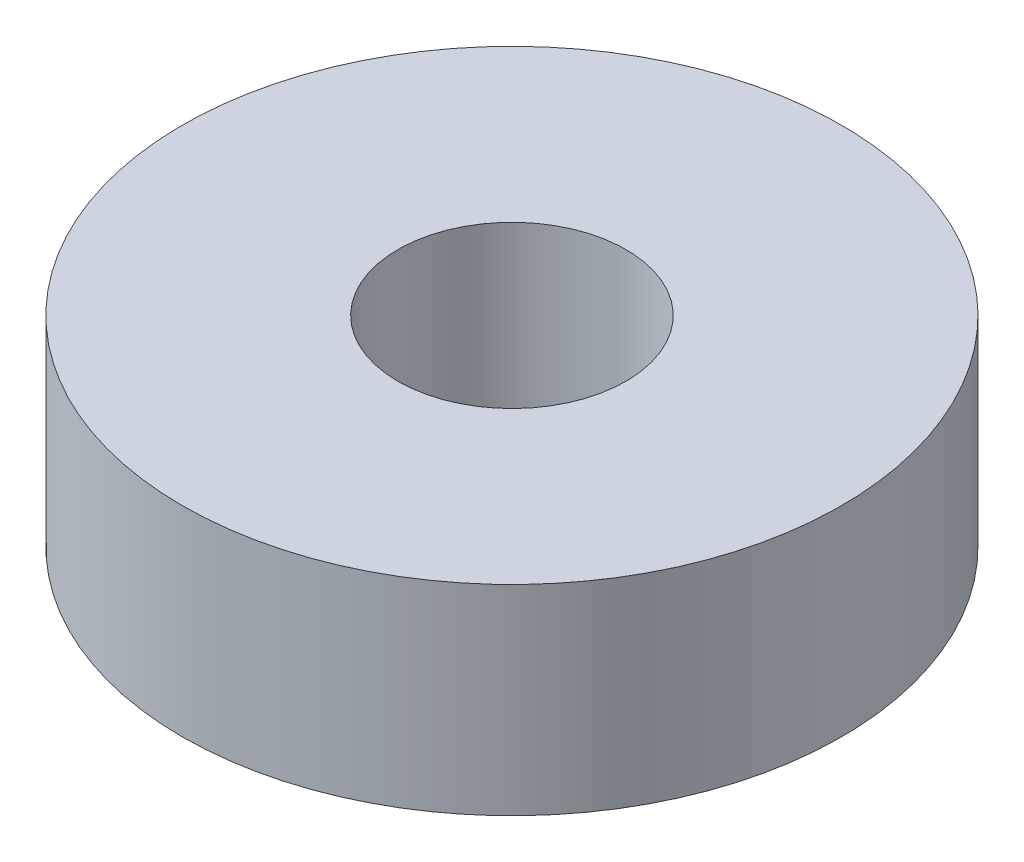
ISO-10303-21;
HEADER;
FILE_DESCRIPTION(('STEP AP214'),'2;1');
FILE_NAME('part.step','',(''),(''),'','','');
FILE_SCHEMA(('AUTOMOTIVE_DESIGN { 1 0 10303 214 1 1 1 1 }'));
ENDSEC;
DATA;
#1=APPLICATION_CONTEXT('core data for automotive mechanical design processes');
#2=APPLICATION_PROTOCOL_DEFINITION('international standard','automotive_design',2000,#1);
#3=PRODUCT_CONTEXT('',#1,'mechanical');
#4=PRODUCT('Part','Part','',(#3));
#5=PRODUCT_RELATED_PRODUCT_CATEGORY('part','',(#4));
#6=PRODUCT_DEFINITION_FORMATION('','',#4);
#7=PRODUCT_DEFINITION_CONTEXT('part definition',#1,'design');
#8=PRODUCT_DEFINITION('design','',#6,#7);
#9=PRODUCT_DEFINITION_SHAPE('','',#8);
#10=(LENGTH_UNIT() NAMED_UNIT(*) SI_UNIT(.MILLI.,.METRE.));
#11=(NAMED_UNIT(*) PLANE_ANGLE_UNIT() SI_UNIT($,.RADIAN.));
#12=(NAMED_UNIT(*) SI_UNIT($,.STERADIAN.) SOLID_ANGLE_UNIT());
#13=UNCERTAINTY_MEASURE_WITH_UNIT(LENGTH_MEASURE(1.E-05),#10,'distance_accuracy_value','');
#14=(GEOMETRIC_REPRESENTATION_CONTEXT(3) GLOBAL_UNCERTAINTY_ASSIGNED_CONTEXT((#13)) GLOBAL_UNIT_ASSIGNED_CONTEXT((#10,
#11,#12)) REPRESENTATION_CONTEXT('',''));
#15=CARTESIAN_POINT('',(0.,0.,0.));
#16=DIRECTION('',(0.,0.,1.));
#17=DIRECTION('',(1.,0.,0.));
#18=AXIS2_PLACEMENT_3D('',#15,#16,#17);
#19=CARTESIAN_POINT('',(0.,7.9,0.));
#20=DIRECTION('',(0.,1.,0.));
#21=DIRECTION('',(0.,0.,1.));
#22=AXIS2_PLACEMENT_3D('',#19,#20,#21);
#23=PLANE('',#22);
#24=CARTESIAN_POINT('',(0.,7.9,0.));
#25=DIRECTION('',(0.,1.,0.));
#26=DIRECTION('',(0.,0.,1.));
#27=AXIS2_PLACEMENT_3D('',#24,#25,#26);
#28=CIRCLE('',#27,13.);
#29=CARTESIAN_POINT('',(0.,7.9,13.));
#30=VERTEX_POINT('',#29);
#31=EDGE_CURVE('E10',#30,#30,#28,.T.);
#32=ORIENTED_EDGE('',*,*,#31,.T.);
#33=EDGE_LOOP('',(#32));
#34=FACE_BOUND('',#33,.T.);
#35=CARTESIAN_POINT('',(0.,7.9,0.));
#36=DIRECTION('',(0.,1.,0.));
#37=DIRECTION('',(0.,0.,1.));
#38=AXIS2_PLACEMENT_3D('',#35,#36,#37);
#39=CIRCLE('',#38,4.5);
#40=CARTESIAN_POINT('',(0.,7.9,4.5));
#41=VERTEX_POINT('',#40);
#42=EDGE_CURVE('E52',#41,#41,#39,.T.);
#43=ORIENTED_EDGE('',*,*,#42,.F.);
#44=EDGE_LOOP('',(#43));
#45=FACE_BOUND('',#44,.T.);
#46=ADVANCED_FACE('F41',(#34,#45),#23,.T.);
#47=CARTESIAN_POINT('',(0.,0.,0.));
#48=DIRECTION('',(0.,1.,0.));
#49=DIRECTION('',(0.,0.,1.));
#50=AXIS2_PLACEMENT_3D('',#47,#48,#49);
#51=PLANE('',#50);
#52=CARTESIAN_POINT('',(0.,0.,0.));
#53=DIRECTION('',(0.,1.,0.));
#54=DIRECTION('',(0.,0.,1.));
#55=AXIS2_PLACEMENT_3D('',#52,#53,#54);
#56=CIRCLE('',#55,13.);
#57=CARTESIAN_POINT('',(0.,0.,13.));
#58=VERTEX_POINT('',#57);
#59=EDGE_CURVE('E45',#58,#58,#56,.T.);
#60=ORIENTED_EDGE('',*,*,#59,.F.);
#61=EDGE_LOOP('',(#60));
#62=FACE_BOUND('',#61,.T.);
#63=CARTESIAN_POINT('',(0.,0.,0.));
#64=DIRECTION('',(0.,1.,0.));
#65=DIRECTION('',(0.,0.,1.));
#66=AXIS2_PLACEMENT_3D('',#63,#64,#65);
#67=CIRCLE('',#66,4.5);
#68=CARTESIAN_POINT('',(0.,0.,4.5));
#69=VERTEX_POINT('',#68);
#70=EDGE_CURVE('E54',#69,#69,#67,.T.);
#71=ORIENTED_EDGE('',*,*,#70,.T.);
#72=EDGE_LOOP('',(#71));
#73=FACE_BOUND('',#72,.T.);
#74=ADVANCED_FACE('F64',(#62,#73),#51,.F.);
#75=CARTESIAN_POINT('',(0.,7.9,0.));
#76=DIRECTION('',(0.,-1.,0.));
#77=DIRECTION('',(0.,0.,-1.));
#78=AXIS2_PLACEMENT_3D('',#75,#76,#77);
#79=CYLINDRICAL_SURFACE('',#78,13.);
#80=ORIENTED_EDGE('',*,*,#31,.F.);
#81=EDGE_LOOP('',(#80));
#82=FACE_BOUND('',#81,.T.);
#83=ORIENTED_EDGE('',*,*,#59,.T.);
#84=EDGE_LOOP('',(#83));
#85=FACE_BOUND('',#84,.T.);
#86=ADVANCED_FACE('F43',(#82,#85),#79,.T.);
#87=CARTESIAN_POINT('',(0.,7.9,0.));
#88=DIRECTION('',(0.,-1.,0.));
#89=DIRECTION('',(0.,0.,-1.));
#90=AXIS2_PLACEMENT_3D('',#87,#88,#89);
#91=CYLINDRICAL_SURFACE('',#90,4.5);
#92=ORIENTED_EDGE('',*,*,#42,.T.);
#93=EDGE_LOOP('',(#92));
#94=FACE_BOUND('',#93,.T.);
#95=ORIENTED_EDGE('',*,*,#70,.F.);
#96=EDGE_LOOP('',(#95));
#97=FACE_BOUND('',#96,.T.);
#98=ADVANCED_FACE('F60',(#94,#97),#91,.F.);
#99=CLOSED_SHELL('',(#46,#74,#86,#98));
#100=MANIFOLD_SOLID_BREP('B2',#99);
#101=ADVANCED_BREP_SHAPE_REPRESENTATION('',(#18,#100),#14);
#102=SHAPE_DEFINITION_REPRESENTATION(#9,#101);
ENDSEC;
END-ISO-10303-21;
